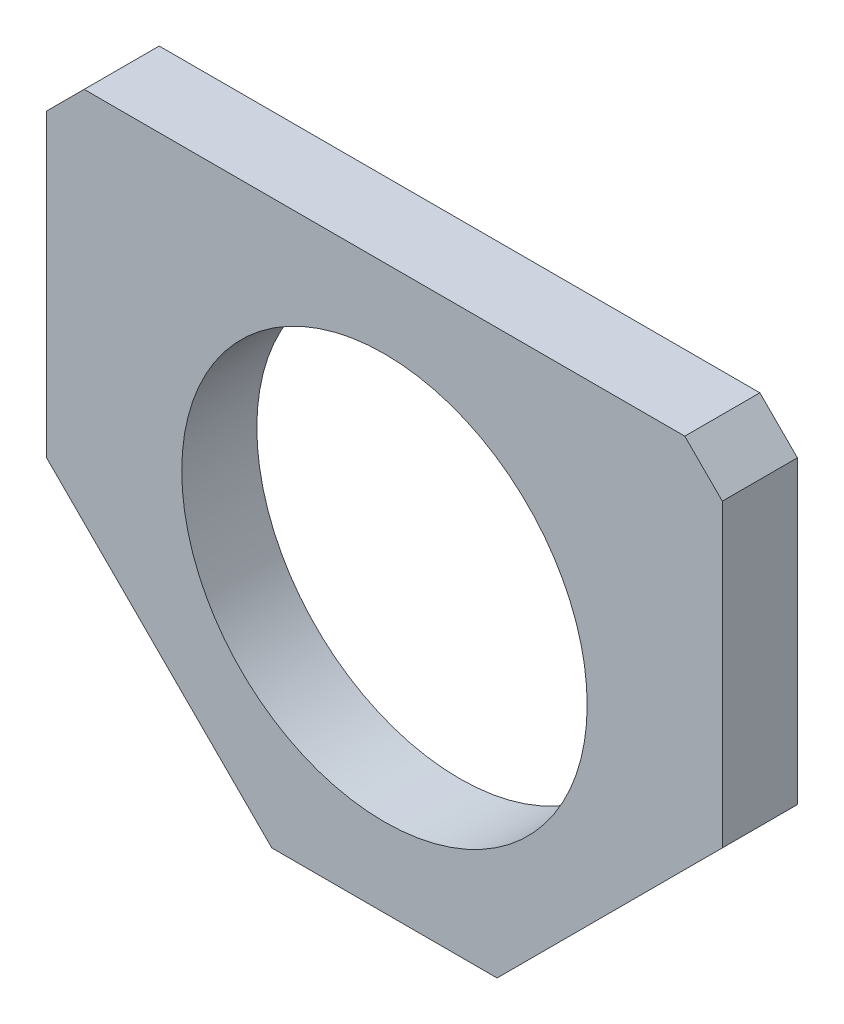
ISO-10303-21;
HEADER;
FILE_DESCRIPTION(('STEP AP214'),'2;1');
FILE_NAME('part.step','',(''),(''),'','','');
FILE_SCHEMA(('AUTOMOTIVE_DESIGN { 1 0 10303 214 1 1 1 1 }'));
ENDSEC;
DATA;
#1=APPLICATION_CONTEXT('core data for automotive mechanical design processes');
#2=APPLICATION_PROTOCOL_DEFINITION('international standard','automotive_design',2000,#1);
#3=PRODUCT_CONTEXT('',#1,'mechanical');
#4=PRODUCT('Part','Part','',(#3));
#5=PRODUCT_RELATED_PRODUCT_CATEGORY('part','',(#4));
#6=PRODUCT_DEFINITION_FORMATION('','',#4);
#7=PRODUCT_DEFINITION_CONTEXT('part definition',#1,'design');
#8=PRODUCT_DEFINITION('design','',#6,#7);
#9=PRODUCT_DEFINITION_SHAPE('','',#8);
#10=(LENGTH_UNIT() NAMED_UNIT(*) SI_UNIT(.MILLI.,.METRE.));
#11=(NAMED_UNIT(*) PLANE_ANGLE_UNIT() SI_UNIT($,.RADIAN.));
#12=(NAMED_UNIT(*) SI_UNIT($,.STERADIAN.) SOLID_ANGLE_UNIT());
#13=UNCERTAINTY_MEASURE_WITH_UNIT(LENGTH_MEASURE(1.E-05),#10,'distance_accuracy_value','');
#14=(GEOMETRIC_REPRESENTATION_CONTEXT(3) GLOBAL_UNCERTAINTY_ASSIGNED_CONTEXT((#13)) GLOBAL_UNIT_ASSIGNED_CONTEXT((#10,
#11,#12)) REPRESENTATION_CONTEXT('',''));
#15=CARTESIAN_POINT('',(0.,0.,0.));
#16=DIRECTION('',(0.,0.,1.));
#17=DIRECTION('',(1.,0.,0.));
#18=AXIS2_PLACEMENT_3D('',#15,#16,#17);
#19=CARTESIAN_POINT('',(9.,-7.5,2.));
#20=DIRECTION('',(-1.,0.,0.));
#21=DIRECTION('',(0.,0.,1.));
#22=AXIS2_PLACEMENT_3D('',#19,#20,#21);
#23=PLANE('',#22);
#24=DIRECTION('',(0.,1.,0.));
#25=VECTOR('',#24,1.);
#26=CARTESIAN_POINT('',(9.,-7.5,2.));
#27=LINE('',#26,#25);
#28=CARTESIAN_POINT('',(9.,-1.5,2.));
#29=VERTEX_POINT('',#28);
#30=CARTESIAN_POINT('',(9.,6.49999999999999,2.));
#31=VERTEX_POINT('',#30);
#32=EDGE_CURVE('E132',#29,#31,#27,.T.);
#33=ORIENTED_EDGE('',*,*,#32,.F.);
#34=DIRECTION('',(0.,0.,-1.));
#35=VECTOR('',#34,1.);
#36=CARTESIAN_POINT('',(9.,-1.5,2.));
#37=LINE('',#36,#35);
#38=CARTESIAN_POINT('',(9.,-1.5,0.));
#39=VERTEX_POINT('',#38);
#40=EDGE_CURVE('E144',#29,#39,#37,.T.);
#41=ORIENTED_EDGE('',*,*,#40,.T.);
#42=DIRECTION('',(0.,1.,0.));
#43=VECTOR('',#42,1.);
#44=CARTESIAN_POINT('',(9.,-7.5,0.));
#45=LINE('',#44,#43);
#46=CARTESIAN_POINT('',(9.,6.49999999999999,0.));
#47=VERTEX_POINT('',#46);
#48=EDGE_CURVE('E123',#39,#47,#45,.T.);
#49=ORIENTED_EDGE('',*,*,#48,.T.);
#50=DIRECTION('',(0.,0.,1.));
#51=VECTOR('',#50,1.);
#52=CARTESIAN_POINT('',(9.,6.49999999999999,2.));
#53=LINE('',#52,#51);
#54=EDGE_CURVE('E104',#47,#31,#53,.T.);
#55=ORIENTED_EDGE('',*,*,#54,.T.);
#56=EDGE_LOOP('',(#33,#41,#49,#55));
#57=FACE_BOUND('',#56,.T.);
#58=ADVANCED_FACE('F30',(#57),#23,.F.);
#59=CARTESIAN_POINT('',(-9.,7.5,2.));
#60=DIRECTION('',(0.,-1.,0.));
#61=DIRECTION('',(0.,0.,-1.));
#62=AXIS2_PLACEMENT_3D('',#59,#60,#61);
#63=PLANE('',#62);
#64=DIRECTION('',(-1.,0.,0.));
#65=VECTOR('',#64,1.);
#66=CARTESIAN_POINT('',(-9.,7.5,2.));
#67=LINE('',#66,#65);
#68=CARTESIAN_POINT('',(8.,7.5,2.));
#69=VERTEX_POINT('',#68);
#70=CARTESIAN_POINT('',(-7.99999999999999,7.5,2.));
#71=VERTEX_POINT('',#70);
#72=EDGE_CURVE('E117',#69,#71,#67,.T.);
#73=ORIENTED_EDGE('',*,*,#72,.F.);
#74=DIRECTION('',(0.,0.,-1.));
#75=VECTOR('',#74,1.);
#76=CARTESIAN_POINT('',(8.,7.5,2.));
#77=LINE('',#76,#75);
#78=CARTESIAN_POINT('',(8.,7.5,0.));
#79=VERTEX_POINT('',#78);
#80=EDGE_CURVE('E102',#69,#79,#77,.T.);
#81=ORIENTED_EDGE('',*,*,#80,.T.);
#82=DIRECTION('',(-1.,0.,0.));
#83=VECTOR('',#82,1.);
#84=CARTESIAN_POINT('',(-9.,7.5,0.));
#85=LINE('',#84,#83);
#86=CARTESIAN_POINT('',(-7.99999999999999,7.5,0.));
#87=VERTEX_POINT('',#86);
#88=EDGE_CURVE('E114',#79,#87,#85,.T.);
#89=ORIENTED_EDGE('',*,*,#88,.T.);
#90=DIRECTION('',(0.,0.,1.));
#91=VECTOR('',#90,1.);
#92=CARTESIAN_POINT('',(-7.99999999999999,7.5,2.));
#93=LINE('',#92,#91);
#94=EDGE_CURVE('E118',#87,#71,#93,.T.);
#95=ORIENTED_EDGE('',*,*,#94,.T.);
#96=EDGE_LOOP('',(#73,#81,#89,#95));
#97=FACE_BOUND('',#96,.T.);
#98=ADVANCED_FACE('F113',(#97),#63,.F.);
#99=CARTESIAN_POINT('',(-9.,-7.5,2.));
#100=DIRECTION('',(1.,0.,0.));
#101=DIRECTION('',(0.,0.,-1.));
#102=AXIS2_PLACEMENT_3D('',#99,#100,#101);
#103=PLANE('',#102);
#104=DIRECTION('',(0.,-1.,0.));
#105=VECTOR('',#104,1.);
#106=CARTESIAN_POINT('',(-9.,-7.5,0.));
#107=LINE('',#106,#105);
#108=CARTESIAN_POINT('',(-9.,6.49999999999999,0.));
#109=VERTEX_POINT('',#108);
#110=CARTESIAN_POINT('',(-9.,-1.49999999999998,0.));
#111=VERTEX_POINT('',#110);
#112=EDGE_CURVE('E122',#109,#111,#107,.T.);
#113=ORIENTED_EDGE('',*,*,#112,.T.);
#114=DIRECTION('',(0.,0.,1.));
#115=VECTOR('',#114,1.);
#116=CARTESIAN_POINT('',(-9.,-1.49999999999998,2.));
#117=LINE('',#116,#115);
#118=CARTESIAN_POINT('',(-9.,-1.49999999999998,2.));
#119=VERTEX_POINT('',#118);
#120=EDGE_CURVE('E11',#111,#119,#117,.T.);
#121=ORIENTED_EDGE('',*,*,#120,.T.);
#122=DIRECTION('',(0.,-1.,0.));
#123=VECTOR('',#122,1.);
#124=CARTESIAN_POINT('',(-9.,-7.5,2.));
#125=LINE('',#124,#123);
#126=CARTESIAN_POINT('',(-9.,6.5,2.));
#127=VERTEX_POINT('',#126);
#128=EDGE_CURVE('E175',#127,#119,#125,.T.);
#129=ORIENTED_EDGE('',*,*,#128,.F.);
#130=DIRECTION('',(0.,0.,-1.));
#131=VECTOR('',#130,1.);
#132=CARTESIAN_POINT('',(-9.,6.5,2.));
#133=LINE('',#132,#131);
#134=EDGE_CURVE('E141',#127,#109,#133,.T.);
#135=ORIENTED_EDGE('',*,*,#134,.T.);
#136=EDGE_LOOP('',(#113,#121,#129,#135));
#137=FACE_BOUND('',#136,.T.);
#138=ADVANCED_FACE('F173',(#137),#103,.F.);
#139=CARTESIAN_POINT('',(-9.,-7.5,2.));
#140=DIRECTION('',(0.,1.,0.));
#141=DIRECTION('',(0.,0.,1.));
#142=AXIS2_PLACEMENT_3D('',#139,#140,#141);
#143=PLANE('',#142);
#144=DIRECTION('',(1.,0.,0.));
#145=VECTOR('',#144,1.);
#146=CARTESIAN_POINT('',(-9.,-7.5,0.));
#147=LINE('',#146,#145);
#148=CARTESIAN_POINT('',(-3.,-7.5,0.));
#149=VERTEX_POINT('',#148);
#150=CARTESIAN_POINT('',(2.99999999999998,-7.5,0.));
#151=VERTEX_POINT('',#150);
#152=EDGE_CURVE('E125',#149,#151,#147,.T.);
#153=ORIENTED_EDGE('',*,*,#152,.T.);
#154=DIRECTION('',(0.,0.,1.));
#155=VECTOR('',#154,1.);
#156=CARTESIAN_POINT('',(2.99999999999998,-7.5,2.));
#157=LINE('',#156,#155);
#158=CARTESIAN_POINT('',(2.99999999999997,-7.5,2.));
#159=VERTEX_POINT('',#158);
#160=EDGE_CURVE('E51',#151,#159,#157,.T.);
#161=ORIENTED_EDGE('',*,*,#160,.T.);
#162=DIRECTION('',(1.,0.,0.));
#163=VECTOR('',#162,1.);
#164=CARTESIAN_POINT('',(-9.,-7.5,2.));
#165=LINE('',#164,#163);
#166=CARTESIAN_POINT('',(-3.,-7.5,2.));
#167=VERTEX_POINT('',#166);
#168=EDGE_CURVE('E133',#167,#159,#165,.T.);
#169=ORIENTED_EDGE('',*,*,#168,.F.);
#170=DIRECTION('',(0.,0.,-1.));
#171=VECTOR('',#170,1.);
#172=CARTESIAN_POINT('',(-3.,-7.5,2.));
#173=LINE('',#172,#171);
#174=EDGE_CURVE('E154',#167,#149,#173,.T.);
#175=ORIENTED_EDGE('',*,*,#174,.T.);
#176=EDGE_LOOP('',(#153,#161,#169,#175));
#177=FACE_BOUND('',#176,.T.);
#178=ADVANCED_FACE('F169',(#177),#143,.F.);
#179=CARTESIAN_POINT('',(9.,7.5,2.));
#180=DIRECTION('',(0.,0.,-1.));
#181=DIRECTION('',(-1.,0.,0.));
#182=AXIS2_PLACEMENT_3D('',#179,#180,#181);
#183=PLANE('',#182);
#184=CARTESIAN_POINT('',(0.,0.,2.));
#185=DIRECTION('',(0.,0.,1.));
#186=DIRECTION('',(1.,0.,0.));
#187=AXIS2_PLACEMENT_3D('',#184,#185,#186);
#188=CIRCLE('',#187,5.39999999999999);
#189=CARTESIAN_POINT('',(5.39999999999999,0.,2.));
#190=VERTEX_POINT('',#189);
#191=EDGE_CURVE('E147',#190,#190,#188,.T.);
#192=ORIENTED_EDGE('',*,*,#191,.F.);
#193=EDGE_LOOP('',(#192));
#194=FACE_BOUND('',#193,.T.);
#195=ORIENTED_EDGE('',*,*,#168,.T.);
#196=DIRECTION('',(-0.707106781186549,-0.707106781186546,0.));
#197=VECTOR('',#196,1.);
#198=CARTESIAN_POINT('',(9.,-1.5,2.));
#199=LINE('',#198,#197);
#200=EDGE_CURVE('E38',#159,#29,#199,.F.);
#201=ORIENTED_EDGE('',*,*,#200,.T.);
#202=ORIENTED_EDGE('',*,*,#32,.T.);
#203=DIRECTION('',(0.707106781186546,-0.707106781186549,0.));
#204=VECTOR('',#203,1.);
#205=CARTESIAN_POINT('',(8.,7.5,2.));
#206=LINE('',#205,#204);
#207=EDGE_CURVE('E139',#31,#69,#206,.F.);
#208=ORIENTED_EDGE('',*,*,#207,.T.);
#209=ORIENTED_EDGE('',*,*,#72,.T.);
#210=DIRECTION('',(0.707106781186549,0.707106781186546,0.));
#211=VECTOR('',#210,1.);
#212=CARTESIAN_POINT('',(-9.,6.5,2.));
#213=LINE('',#212,#211);
#214=EDGE_CURVE('E137',#71,#127,#213,.F.);
#215=ORIENTED_EDGE('',*,*,#214,.T.);
#216=ORIENTED_EDGE('',*,*,#128,.T.);
#217=DIRECTION('',(-0.707106781186546,0.707106781186549,0.));
#218=VECTOR('',#217,1.);
#219=CARTESIAN_POINT('',(-3.,-7.5,2.));
#220=LINE('',#219,#218);
#221=EDGE_CURVE('E158',#119,#167,#220,.F.);
#222=ORIENTED_EDGE('',*,*,#221,.T.);
#223=EDGE_LOOP('',(#195,#201,#202,#208,#209,#215,#216,#222));
#224=FACE_BOUND('',#223,.T.);
#225=ADVANCED_FACE('F162',(#194,#224),#183,.F.);
#226=CARTESIAN_POINT('',(9.,7.5,0.));
#227=DIRECTION('',(0.,0.,-1.));
#228=DIRECTION('',(-1.,0.,0.));
#229=AXIS2_PLACEMENT_3D('',#226,#227,#228);
#230=PLANE('',#229);
#231=CARTESIAN_POINT('',(0.,0.,0.));
#232=DIRECTION('',(0.,0.,-1.));
#233=DIRECTION('',(-1.,0.,0.));
#234=AXIS2_PLACEMENT_3D('',#231,#232,#233);
#235=CIRCLE('',#234,5.39999999999999);
#236=CARTESIAN_POINT('',(-5.39999999999999,0.,0.));
#237=VERTEX_POINT('',#236);
#238=EDGE_CURVE('E127',#237,#237,#235,.T.);
#239=ORIENTED_EDGE('',*,*,#238,.F.);
#240=EDGE_LOOP('',(#239));
#241=FACE_BOUND('',#240,.T.);
#242=ORIENTED_EDGE('',*,*,#48,.F.);
#243=DIRECTION('',(0.707106781186549,0.707106781186546,0.));
#244=VECTOR('',#243,1.);
#245=CARTESIAN_POINT('',(13.5,2.99999999999999,0.));
#246=LINE('',#245,#244);
#247=EDGE_CURVE('E152',#39,#151,#246,.F.);
#248=ORIENTED_EDGE('',*,*,#247,.T.);
#249=ORIENTED_EDGE('',*,*,#152,.F.);
#250=DIRECTION('',(0.707106781186546,-0.707106781186549,0.));
#251=VECTOR('',#250,1.);
#252=CARTESIAN_POINT('',(-4.50000000000002,-5.99999999999998,0.));
#253=LINE('',#252,#251);
#254=EDGE_CURVE('E150',#149,#111,#253,.F.);
#255=ORIENTED_EDGE('',*,*,#254,.T.);
#256=ORIENTED_EDGE('',*,*,#112,.F.);
#257=DIRECTION('',(-0.707106781186549,-0.707106781186546,0.));
#258=VECTOR('',#257,1.);
#259=CARTESIAN_POINT('',(0.500000000000033,16.,0.));
#260=LINE('',#259,#258);
#261=EDGE_CURVE('E108',#109,#87,#260,.F.);
#262=ORIENTED_EDGE('',*,*,#261,.T.);
#263=ORIENTED_EDGE('',*,*,#88,.F.);
#264=DIRECTION('',(-0.707106781186546,0.707106781186549,0.));
#265=VECTOR('',#264,1.);
#266=CARTESIAN_POINT('',(8.5,7.,0.));
#267=LINE('',#266,#265);
#268=EDGE_CURVE('E98',#79,#47,#267,.F.);
#269=ORIENTED_EDGE('',*,*,#268,.T.);
#270=EDGE_LOOP('',(#242,#248,#249,#255,#256,#262,#263,#269));
#271=FACE_BOUND('',#270,.T.);
#272=ADVANCED_FACE('F120',(#241,#271),#230,.T.);
#273=CARTESIAN_POINT('',(8.,7.5,2.));
#274=DIRECTION('',(-0.707106781186549,-0.707106781186546,0.));
#275=DIRECTION('',(0.707106781186546,-0.707106781186549,0.));
#276=AXIS2_PLACEMENT_3D('',#273,#274,#275);
#277=PLANE('',#276);
#278=ORIENTED_EDGE('',*,*,#207,.F.);
#279=ORIENTED_EDGE('',*,*,#54,.F.);
#280=ORIENTED_EDGE('',*,*,#268,.F.);
#281=ORIENTED_EDGE('',*,*,#80,.F.);
#282=EDGE_LOOP('',(#278,#279,#280,#281));
#283=FACE_BOUND('',#282,.T.);
#284=ADVANCED_FACE('F101',(#283),#277,.F.);
#285=CARTESIAN_POINT('',(-9.,6.5,2.));
#286=DIRECTION('',(0.707106781186546,-0.707106781186549,0.));
#287=DIRECTION('',(0.707106781186549,0.707106781186546,0.));
#288=AXIS2_PLACEMENT_3D('',#285,#286,#287);
#289=PLANE('',#288);
#290=ORIENTED_EDGE('',*,*,#214,.F.);
#291=ORIENTED_EDGE('',*,*,#94,.F.);
#292=ORIENTED_EDGE('',*,*,#261,.F.);
#293=ORIENTED_EDGE('',*,*,#134,.F.);
#294=EDGE_LOOP('',(#290,#291,#292,#293));
#295=FACE_BOUND('',#294,.T.);
#296=ADVANCED_FACE('F178',(#295),#289,.F.);
#297=CARTESIAN_POINT('',(0.,0.,2.));
#298=DIRECTION('',(0.,0.,1.));
#299=DIRECTION('',(1.,0.,0.));
#300=AXIS2_PLACEMENT_3D('',#297,#298,#299);
#301=CYLINDRICAL_SURFACE('',#300,5.39999999999999);
#302=ORIENTED_EDGE('',*,*,#238,.T.);
#303=EDGE_LOOP('',(#302));
#304=FACE_BOUND('',#303,.T.);
#305=ORIENTED_EDGE('',*,*,#191,.T.);
#306=EDGE_LOOP('',(#305));
#307=FACE_BOUND('',#306,.T.);
#308=ADVANCED_FACE('F185',(#304,#307),#301,.F.);
#309=CARTESIAN_POINT('',(9.,-1.5,2.));
#310=DIRECTION('',(-0.707106781186546,0.707106781186549,0.));
#311=DIRECTION('',(-0.707106781186549,-0.707106781186546,0.));
#312=AXIS2_PLACEMENT_3D('',#309,#310,#311);
#313=PLANE('',#312);
#314=ORIENTED_EDGE('',*,*,#200,.F.);
#315=ORIENTED_EDGE('',*,*,#160,.F.);
#316=ORIENTED_EDGE('',*,*,#247,.F.);
#317=ORIENTED_EDGE('',*,*,#40,.F.);
#318=EDGE_LOOP('',(#314,#315,#316,#317));
#319=FACE_BOUND('',#318,.T.);
#320=ADVANCED_FACE('F167',(#319),#313,.F.);
#321=CARTESIAN_POINT('',(-3.,-7.5,2.));
#322=DIRECTION('',(0.707106781186549,0.707106781186546,0.));
#323=DIRECTION('',(-0.707106781186546,0.707106781186549,0.));
#324=AXIS2_PLACEMENT_3D('',#321,#322,#323);
#325=PLANE('',#324);
#326=ORIENTED_EDGE('',*,*,#221,.F.);
#327=ORIENTED_EDGE('',*,*,#120,.F.);
#328=ORIENTED_EDGE('',*,*,#254,.F.);
#329=ORIENTED_EDGE('',*,*,#174,.F.);
#330=EDGE_LOOP('',(#326,#327,#328,#329));
#331=FACE_BOUND('',#330,.T.);
#332=ADVANCED_FACE('F32',(#331),#325,.F.);
#333=CLOSED_SHELL('',(#58,#98,#138,#178,#225,#272,#284,#296,#308,#320,#332));
#334=MANIFOLD_SOLID_BREP('B2',#333);
#335=ADVANCED_BREP_SHAPE_REPRESENTATION('',(#18,#334),#14);
#336=SHAPE_DEFINITION_REPRESENTATION(#9,#335);
ENDSEC;
END-ISO-10303-21;
